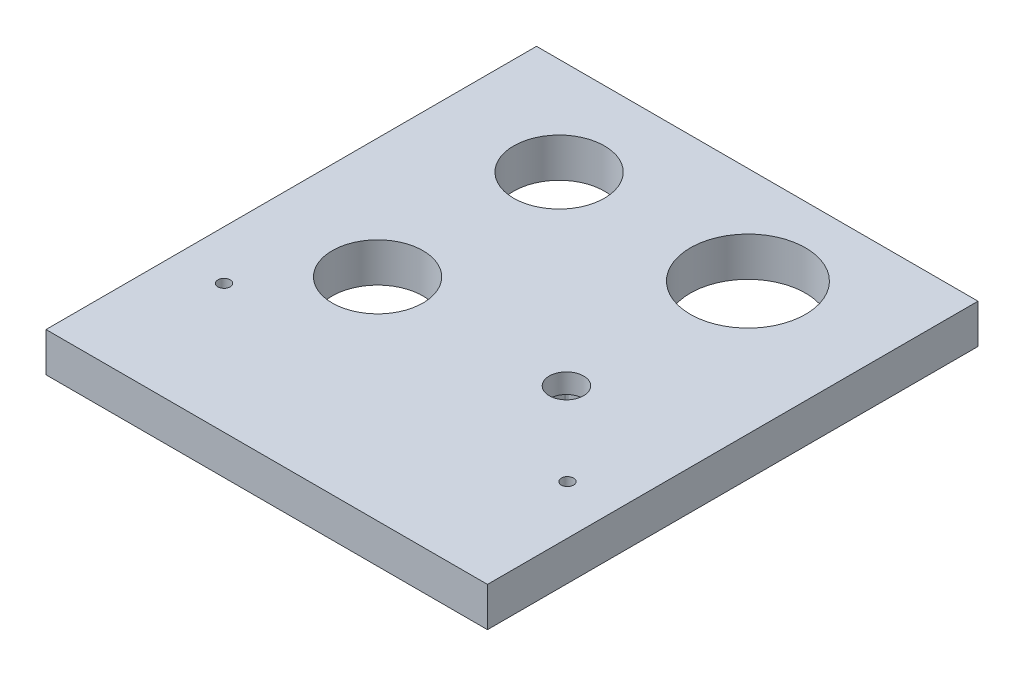
ISO-10303-21;
HEADER;
FILE_DESCRIPTION(('STEP AP214'),'2;1');
FILE_NAME('part.step','',(''),(''),'','','');
FILE_SCHEMA(('AUTOMOTIVE_DESIGN { 1 0 10303 214 1 1 1 1 }'));
ENDSEC;
DATA;
#1=APPLICATION_CONTEXT('core data for automotive mechanical design processes');
#2=APPLICATION_PROTOCOL_DEFINITION('international standard','automotive_design',2000,#1);
#3=PRODUCT_CONTEXT('',#1,'mechanical');
#4=PRODUCT('Part','Part','',(#3));
#5=PRODUCT_RELATED_PRODUCT_CATEGORY('part','',(#4));
#6=PRODUCT_DEFINITION_FORMATION('','',#4);
#7=PRODUCT_DEFINITION_CONTEXT('part definition',#1,'design');
#8=PRODUCT_DEFINITION('design','',#6,#7);
#9=PRODUCT_DEFINITION_SHAPE('','',#8);
#10=(LENGTH_UNIT() NAMED_UNIT(*) SI_UNIT(.MILLI.,.METRE.));
#11=(NAMED_UNIT(*) PLANE_ANGLE_UNIT() SI_UNIT($,.RADIAN.));
#12=(NAMED_UNIT(*) SI_UNIT($,.STERADIAN.) SOLID_ANGLE_UNIT());
#13=UNCERTAINTY_MEASURE_WITH_UNIT(LENGTH_MEASURE(1.E-05),#10,'distance_accuracy_value','');
#14=(GEOMETRIC_REPRESENTATION_CONTEXT(3) GLOBAL_UNCERTAINTY_ASSIGNED_CONTEXT((#13)) GLOBAL_UNIT_ASSIGNED_CONTEXT((#10,
#11,#12)) REPRESENTATION_CONTEXT('',''));
#15=CARTESIAN_POINT('',(0.,0.,0.));
#16=DIRECTION('',(0.,0.,1.));
#17=DIRECTION('',(1.,0.,0.));
#18=AXIS2_PLACEMENT_3D('',#15,#16,#17);
#19=CARTESIAN_POINT('',(-45.,8.,-50.));
#20=DIRECTION('',(1.,0.,0.));
#21=DIRECTION('',(0.,0.,-1.));
#22=AXIS2_PLACEMENT_3D('',#19,#20,#21);
#23=PLANE('',#22);
#24=DIRECTION('',(0.,0.,1.));
#25=VECTOR('',#24,1.);
#26=CARTESIAN_POINT('',(-45.,0.,-50.));
#27=LINE('',#26,#25);
#28=CARTESIAN_POINT('',(-45.,0.,-50.));
#29=VERTEX_POINT('',#28);
#30=CARTESIAN_POINT('',(-45.,0.,50.));
#31=VERTEX_POINT('',#30);
#32=EDGE_CURVE('E151',#29,#31,#27,.T.);
#33=ORIENTED_EDGE('',*,*,#32,.T.);
#34=DIRECTION('',(0.,-1.,0.));
#35=VECTOR('',#34,1.);
#36=CARTESIAN_POINT('',(-45.,8.,50.));
#37=LINE('',#36,#35);
#38=CARTESIAN_POINT('',(-45.,8.,50.));
#39=VERTEX_POINT('',#38);
#40=EDGE_CURVE('E132',#39,#31,#37,.T.);
#41=ORIENTED_EDGE('',*,*,#40,.F.);
#42=DIRECTION('',(0.,0.,1.));
#43=VECTOR('',#42,1.);
#44=CARTESIAN_POINT('',(-45.,8.,-50.));
#45=LINE('',#44,#43);
#46=CARTESIAN_POINT('',(-45.,8.,-50.));
#47=VERTEX_POINT('',#46);
#48=EDGE_CURVE('E139',#47,#39,#45,.T.);
#49=ORIENTED_EDGE('',*,*,#48,.F.);
#50=DIRECTION('',(0.,-1.,0.));
#51=VECTOR('',#50,1.);
#52=CARTESIAN_POINT('',(-45.,8.,-50.));
#53=LINE('',#52,#51);
#54=EDGE_CURVE('E250',#47,#29,#53,.T.);
#55=ORIENTED_EDGE('',*,*,#54,.T.);
#56=EDGE_LOOP('',(#33,#41,#49,#55));
#57=FACE_BOUND('',#56,.T.);
#58=ADVANCED_FACE('F38',(#57),#23,.F.);
#59=CARTESIAN_POINT('',(45.,8.,50.));
#60=DIRECTION('',(0.,0.,-1.));
#61=DIRECTION('',(-1.,0.,0.));
#62=AXIS2_PLACEMENT_3D('',#59,#60,#61);
#63=PLANE('',#62);
#64=DIRECTION('',(1.,0.,0.));
#65=VECTOR('',#64,1.);
#66=CARTESIAN_POINT('',(45.,0.,50.));
#67=LINE('',#66,#65);
#68=CARTESIAN_POINT('',(45.,0.,50.));
#69=VERTEX_POINT('',#68);
#70=EDGE_CURVE('E252',#31,#69,#67,.T.);
#71=ORIENTED_EDGE('',*,*,#70,.T.);
#72=DIRECTION('',(0.,-1.,0.));
#73=VECTOR('',#72,1.);
#74=CARTESIAN_POINT('',(45.,8.,50.));
#75=LINE('',#74,#73);
#76=CARTESIAN_POINT('',(45.,8.,50.));
#77=VERTEX_POINT('',#76);
#78=EDGE_CURVE('E135',#77,#69,#75,.T.);
#79=ORIENTED_EDGE('',*,*,#78,.F.);
#80=DIRECTION('',(1.,0.,0.));
#81=VECTOR('',#80,1.);
#82=CARTESIAN_POINT('',(45.,8.,50.));
#83=LINE('',#82,#81);
#84=EDGE_CURVE('E128',#39,#77,#83,.T.);
#85=ORIENTED_EDGE('',*,*,#84,.F.);
#86=ORIENTED_EDGE('',*,*,#40,.T.);
#87=EDGE_LOOP('',(#71,#79,#85,#86));
#88=FACE_BOUND('',#87,.T.);
#89=ADVANCED_FACE('F130',(#88),#63,.F.);
#90=CARTESIAN_POINT('',(45.,8.,-50.));
#91=DIRECTION('',(-1.,0.,0.));
#92=DIRECTION('',(0.,0.,1.));
#93=AXIS2_PLACEMENT_3D('',#90,#91,#92);
#94=PLANE('',#93);
#95=DIRECTION('',(0.,0.,-1.));
#96=VECTOR('',#95,1.);
#97=CARTESIAN_POINT('',(45.,0.,-50.));
#98=LINE('',#97,#96);
#99=CARTESIAN_POINT('',(45.,0.,-50.));
#100=VERTEX_POINT('',#99);
#101=EDGE_CURVE('E254',#69,#100,#98,.T.);
#102=ORIENTED_EDGE('',*,*,#101,.T.);
#103=DIRECTION('',(0.,-1.,0.));
#104=VECTOR('',#103,1.);
#105=CARTESIAN_POINT('',(45.,8.,-50.));
#106=LINE('',#105,#104);
#107=CARTESIAN_POINT('',(45.,8.,-50.));
#108=VERTEX_POINT('',#107);
#109=EDGE_CURVE('E156',#108,#100,#106,.T.);
#110=ORIENTED_EDGE('',*,*,#109,.F.);
#111=DIRECTION('',(0.,0.,-1.));
#112=VECTOR('',#111,1.);
#113=CARTESIAN_POINT('',(45.,8.,-50.));
#114=LINE('',#113,#112);
#115=EDGE_CURVE('E138',#77,#108,#114,.T.);
#116=ORIENTED_EDGE('',*,*,#115,.F.);
#117=ORIENTED_EDGE('',*,*,#78,.T.);
#118=EDGE_LOOP('',(#102,#110,#116,#117));
#119=FACE_BOUND('',#118,.T.);
#120=ADVANCED_FACE('F266',(#119),#94,.F.);
#121=CARTESIAN_POINT('',(45.,8.,-50.));
#122=DIRECTION('',(0.,0.,1.));
#123=DIRECTION('',(1.,0.,0.));
#124=AXIS2_PLACEMENT_3D('',#121,#122,#123);
#125=PLANE('',#124);
#126=DIRECTION('',(-1.,0.,0.));
#127=VECTOR('',#126,1.);
#128=CARTESIAN_POINT('',(45.,0.,-50.));
#129=LINE('',#128,#127);
#130=EDGE_CURVE('E148',#100,#29,#129,.T.);
#131=ORIENTED_EDGE('',*,*,#130,.T.);
#132=ORIENTED_EDGE('',*,*,#54,.F.);
#133=DIRECTION('',(-1.,0.,0.));
#134=VECTOR('',#133,1.);
#135=CARTESIAN_POINT('',(45.,8.,-50.));
#136=LINE('',#135,#134);
#137=EDGE_CURVE('E144',#108,#47,#136,.T.);
#138=ORIENTED_EDGE('',*,*,#137,.F.);
#139=ORIENTED_EDGE('',*,*,#109,.T.);
#140=EDGE_LOOP('',(#131,#132,#138,#139));
#141=FACE_BOUND('',#140,.T.);
#142=ADVANCED_FACE('F261',(#141),#125,.F.);
#143=CARTESIAN_POINT('',(0.,8.,0.));
#144=DIRECTION('',(0.,-1.,0.));
#145=DIRECTION('',(0.,0.,-1.));
#146=AXIS2_PLACEMENT_3D('',#143,#144,#145);
#147=PLANE('',#146);
#148=CARTESIAN_POINT('',(35.0000000000009,8.,23.7));
#149=DIRECTION('',(0.,1.,0.));
#150=DIRECTION('',(0.,0.,1.));
#151=AXIS2_PLACEMENT_3D('',#148,#149,#150);
#152=CIRCLE('',#151,1.25);
#153=CARTESIAN_POINT('',(35.0000000000009,8.,24.95));
#154=VERTEX_POINT('',#153);
#155=EDGE_CURVE('E205',#154,#154,#152,.T.);
#156=ORIENTED_EDGE('',*,*,#155,.F.);
#157=EDGE_LOOP('',(#156));
#158=FACE_BOUND('',#157,.T.);
#159=CARTESIAN_POINT('',(-34.9999999999991,8.,23.7));
#160=DIRECTION('',(0.,1.,0.));
#161=DIRECTION('',(0.,0.,1.));
#162=AXIS2_PLACEMENT_3D('',#159,#160,#161);
#163=CIRCLE('',#162,1.25);
#164=CARTESIAN_POINT('',(-34.9999999999991,8.,24.95));
#165=VERTEX_POINT('',#164);
#166=EDGE_CURVE('E195',#165,#165,#163,.T.);
#167=ORIENTED_EDGE('',*,*,#166,.F.);
#168=EDGE_LOOP('',(#167));
#169=FACE_BOUND('',#168,.T.);
#170=CARTESIAN_POINT('',(18.,8.,6.89999999999999));
#171=DIRECTION('',(0.,-1.,0.));
#172=DIRECTION('',(0.,0.,-1.));
#173=AXIS2_PLACEMENT_3D('',#170,#171,#172);
#174=CIRCLE('',#173,3.5);
#175=CARTESIAN_POINT('',(18.,8.,3.39999999999999));
#176=VERTEX_POINT('',#175);
#177=EDGE_CURVE('E189',#176,#176,#174,.T.);
#178=ORIENTED_EDGE('',*,*,#177,.T.);
#179=EDGE_LOOP('',(#178));
#180=FACE_BOUND('',#179,.T.);
#181=CARTESIAN_POINT('',(18.,8.,-30.1));
#182=DIRECTION('',(0.,1.,0.));
#183=DIRECTION('',(0.,0.,1.));
#184=AXIS2_PLACEMENT_3D('',#181,#182,#183);
#185=CIRCLE('',#184,11.75);
#186=CARTESIAN_POINT('',(18.,8.,-18.35));
#187=VERTEX_POINT('',#186);
#188=EDGE_CURVE('E230',#187,#187,#185,.T.);
#189=ORIENTED_EDGE('',*,*,#188,.F.);
#190=EDGE_LOOP('',(#189));
#191=FACE_BOUND('',#190,.T.);
#192=CARTESIAN_POINT('',(-20.5,8.,6.89999999999998));
#193=DIRECTION('',(0.,1.,0.));
#194=DIRECTION('',(0.,0.,1.));
#195=AXIS2_PLACEMENT_3D('',#192,#193,#194);
#196=CIRCLE('',#195,9.25);
#197=CARTESIAN_POINT('',(-20.5,8.,16.15));
#198=VERTEX_POINT('',#197);
#199=EDGE_CURVE('E236',#198,#198,#196,.T.);
#200=ORIENTED_EDGE('',*,*,#199,.F.);
#201=EDGE_LOOP('',(#200));
#202=FACE_BOUND('',#201,.T.);
#203=CARTESIAN_POINT('',(-20.5,8.,-30.1));
#204=DIRECTION('',(0.,1.,0.));
#205=DIRECTION('',(0.,0.,1.));
#206=AXIS2_PLACEMENT_3D('',#203,#204,#205);
#207=CIRCLE('',#206,9.25);
#208=CARTESIAN_POINT('',(-20.5,8.,-20.85));
#209=VERTEX_POINT('',#208);
#210=EDGE_CURVE('E242',#209,#209,#207,.T.);
#211=ORIENTED_EDGE('',*,*,#210,.F.);
#212=EDGE_LOOP('',(#211));
#213=FACE_BOUND('',#212,.T.);
#214=ORIENTED_EDGE('',*,*,#48,.T.);
#215=ORIENTED_EDGE('',*,*,#84,.T.);
#216=ORIENTED_EDGE('',*,*,#115,.T.);
#217=ORIENTED_EDGE('',*,*,#137,.T.);
#218=EDGE_LOOP('',(#214,#215,#216,#217));
#219=FACE_BOUND('',#218,.T.);
#220=ADVANCED_FACE('F142',(#158,#169,#180,#191,#202,#213,#219),#147,.F.);
#221=CARTESIAN_POINT('',(0.,0.,0.));
#222=DIRECTION('',(0.,-1.,0.));
#223=DIRECTION('',(0.,0.,-1.));
#224=AXIS2_PLACEMENT_3D('',#221,#222,#223);
#225=PLANE('',#224);
#226=CARTESIAN_POINT('',(35.0000000000009,0.,23.7));
#227=DIRECTION('',(0.,-1.,0.));
#228=DIRECTION('',(0.,0.,-1.));
#229=AXIS2_PLACEMENT_3D('',#226,#227,#228);
#230=CIRCLE('',#229,1.25);
#231=CARTESIAN_POINT('',(35.0000000000009,0.,22.45));
#232=VERTEX_POINT('',#231);
#233=EDGE_CURVE('E42',#232,#232,#230,.T.);
#234=ORIENTED_EDGE('',*,*,#233,.F.);
#235=EDGE_LOOP('',(#234));
#236=FACE_BOUND('',#235,.T.);
#237=CARTESIAN_POINT('',(-34.9999999999991,0.,23.7));
#238=DIRECTION('',(0.,-1.,0.));
#239=DIRECTION('',(0.,0.,-1.));
#240=AXIS2_PLACEMENT_3D('',#237,#238,#239);
#241=CIRCLE('',#240,1.25);
#242=CARTESIAN_POINT('',(-34.9999999999991,0.,22.45));
#243=VERTEX_POINT('',#242);
#244=EDGE_CURVE('E193',#243,#243,#241,.T.);
#245=ORIENTED_EDGE('',*,*,#244,.F.);
#246=EDGE_LOOP('',(#245));
#247=FACE_BOUND('',#246,.T.);
#248=DIRECTION('',(0.,0.,-1.));
#249=VECTOR('',#248,1.);
#250=CARTESIAN_POINT('',(14.,0.,10.9));
#251=LINE('',#250,#249);
#252=CARTESIAN_POINT('',(14.,0.,10.6));
#253=VERTEX_POINT('',#252);
#254=CARTESIAN_POINT('',(14.,0.,3.19999999999999));
#255=VERTEX_POINT('',#254);
#256=EDGE_CURVE('E191',#253,#255,#251,.T.);
#257=ORIENTED_EDGE('',*,*,#256,.F.);
#258=CARTESIAN_POINT('',(14.3,0.,10.6));
#259=DIRECTION('',(0.,-1.,0.));
#260=DIRECTION('',(0.,0.,-1.));
#261=AXIS2_PLACEMENT_3D('',#258,#259,#260);
#262=CIRCLE('',#261,0.3);
#263=CARTESIAN_POINT('',(14.3,0.,10.9));
#264=VERTEX_POINT('',#263);
#265=EDGE_CURVE('E184',#253,#264,#262,.F.);
#266=ORIENTED_EDGE('',*,*,#265,.T.);
#267=DIRECTION('',(-1.,0.,0.));
#268=VECTOR('',#267,1.);
#269=CARTESIAN_POINT('',(22.,0.,10.9));
#270=LINE('',#269,#268);
#271=CARTESIAN_POINT('',(21.7,0.,10.9));
#272=VERTEX_POINT('',#271);
#273=EDGE_CURVE('E212',#272,#264,#270,.T.);
#274=ORIENTED_EDGE('',*,*,#273,.F.);
#275=CARTESIAN_POINT('',(21.7,0.,10.6));
#276=DIRECTION('',(0.,-1.,0.));
#277=DIRECTION('',(0.,0.,-1.));
#278=AXIS2_PLACEMENT_3D('',#275,#276,#277);
#279=CIRCLE('',#278,0.3);
#280=CARTESIAN_POINT('',(22.,0.,10.6));
#281=VERTEX_POINT('',#280);
#282=EDGE_CURVE('E12',#272,#281,#279,.F.);
#283=ORIENTED_EDGE('',*,*,#282,.T.);
#284=DIRECTION('',(0.,0.,1.));
#285=VECTOR('',#284,1.);
#286=CARTESIAN_POINT('',(22.,0.,10.9));
#287=LINE('',#286,#285);
#288=CARTESIAN_POINT('',(22.,0.,3.19999999999999));
#289=VERTEX_POINT('',#288);
#290=EDGE_CURVE('E224',#289,#281,#287,.T.);
#291=ORIENTED_EDGE('',*,*,#290,.F.);
#292=CARTESIAN_POINT('',(21.7,0.,3.19999999999999));
#293=DIRECTION('',(0.,-1.,0.));
#294=DIRECTION('',(0.,0.,-1.));
#295=AXIS2_PLACEMENT_3D('',#292,#293,#294);
#296=CIRCLE('',#295,0.3);
#297=CARTESIAN_POINT('',(21.7,0.,2.89999999999999));
#298=VERTEX_POINT('',#297);
#299=EDGE_CURVE('E47',#289,#298,#296,.F.);
#300=ORIENTED_EDGE('',*,*,#299,.T.);
#301=DIRECTION('',(1.,0.,0.));
#302=VECTOR('',#301,1.);
#303=CARTESIAN_POINT('',(22.,0.,2.89999999999999));
#304=LINE('',#303,#302);
#305=CARTESIAN_POINT('',(14.3,0.,2.89999999999999));
#306=VERTEX_POINT('',#305);
#307=EDGE_CURVE('E221',#306,#298,#304,.T.);
#308=ORIENTED_EDGE('',*,*,#307,.F.);
#309=CARTESIAN_POINT('',(14.3,0.,3.19999999999999));
#310=DIRECTION('',(0.,-1.,0.));
#311=DIRECTION('',(0.,0.,-1.));
#312=AXIS2_PLACEMENT_3D('',#309,#310,#311);
#313=CIRCLE('',#312,0.3);
#314=EDGE_CURVE('E186',#306,#255,#313,.F.);
#315=ORIENTED_EDGE('',*,*,#314,.T.);
#316=EDGE_LOOP('',(#257,#266,#274,#283,#291,#300,#308,#315));
#317=FACE_BOUND('',#316,.T.);
#318=CARTESIAN_POINT('',(18.,0.,-30.1));
#319=DIRECTION('',(0.,1.,0.));
#320=DIRECTION('',(0.,0.,1.));
#321=AXIS2_PLACEMENT_3D('',#318,#319,#320);
#322=CIRCLE('',#321,11.75);
#323=CARTESIAN_POINT('',(18.,0.,-18.35));
#324=VERTEX_POINT('',#323);
#325=EDGE_CURVE('E233',#324,#324,#322,.T.);
#326=ORIENTED_EDGE('',*,*,#325,.T.);
#327=EDGE_LOOP('',(#326));
#328=FACE_BOUND('',#327,.T.);
#329=CARTESIAN_POINT('',(-20.5,0.,6.89999999999998));
#330=DIRECTION('',(0.,1.,0.));
#331=DIRECTION('',(0.,0.,1.));
#332=AXIS2_PLACEMENT_3D('',#329,#330,#331);
#333=CIRCLE('',#332,9.25);
#334=CARTESIAN_POINT('',(-20.5,0.,16.15));
#335=VERTEX_POINT('',#334);
#336=EDGE_CURVE('E239',#335,#335,#333,.T.);
#337=ORIENTED_EDGE('',*,*,#336,.T.);
#338=EDGE_LOOP('',(#337));
#339=FACE_BOUND('',#338,.T.);
#340=CARTESIAN_POINT('',(-20.5,0.,-30.1));
#341=DIRECTION('',(0.,1.,0.));
#342=DIRECTION('',(0.,0.,1.));
#343=AXIS2_PLACEMENT_3D('',#340,#341,#342);
#344=CIRCLE('',#343,9.25);
#345=CARTESIAN_POINT('',(-20.5,0.,-20.85));
#346=VERTEX_POINT('',#345);
#347=EDGE_CURVE('E245',#346,#346,#344,.T.);
#348=ORIENTED_EDGE('',*,*,#347,.T.);
#349=EDGE_LOOP('',(#348));
#350=FACE_BOUND('',#349,.T.);
#351=ORIENTED_EDGE('',*,*,#32,.F.);
#352=ORIENTED_EDGE('',*,*,#130,.F.);
#353=ORIENTED_EDGE('',*,*,#101,.F.);
#354=ORIENTED_EDGE('',*,*,#70,.F.);
#355=EDGE_LOOP('',(#351,#352,#353,#354));
#356=FACE_BOUND('',#355,.T.);
#357=ADVANCED_FACE('F265',(#236,#247,#317,#328,#339,#350,#356),#225,.T.);
#358=CARTESIAN_POINT('',(-20.5,8.,-30.1));
#359=DIRECTION('',(0.,1.,0.));
#360=DIRECTION('',(0.,0.,1.));
#361=AXIS2_PLACEMENT_3D('',#358,#359,#360);
#362=CYLINDRICAL_SURFACE('',#361,9.25);
#363=ORIENTED_EDGE('',*,*,#347,.F.);
#364=EDGE_LOOP('',(#363));
#365=FACE_BOUND('',#364,.T.);
#366=ORIENTED_EDGE('',*,*,#210,.T.);
#367=EDGE_LOOP('',(#366));
#368=FACE_BOUND('',#367,.T.);
#369=ADVANCED_FACE('F322',(#365,#368),#362,.F.);
#370=CARTESIAN_POINT('',(-20.5,8.,6.89999999999998));
#371=DIRECTION('',(0.,1.,0.));
#372=DIRECTION('',(0.,0.,1.));
#373=AXIS2_PLACEMENT_3D('',#370,#371,#372);
#374=CYLINDRICAL_SURFACE('',#373,9.25);
#375=ORIENTED_EDGE('',*,*,#336,.F.);
#376=EDGE_LOOP('',(#375));
#377=FACE_BOUND('',#376,.T.);
#378=ORIENTED_EDGE('',*,*,#199,.T.);
#379=EDGE_LOOP('',(#378));
#380=FACE_BOUND('',#379,.T.);
#381=ADVANCED_FACE('F333',(#377,#380),#374,.F.);
#382=CARTESIAN_POINT('',(18.,8.,-30.1));
#383=DIRECTION('',(0.,1.,0.));
#384=DIRECTION('',(0.,0.,1.));
#385=AXIS2_PLACEMENT_3D('',#382,#383,#384);
#386=CYLINDRICAL_SURFACE('',#385,11.75);
#387=ORIENTED_EDGE('',*,*,#325,.F.);
#388=EDGE_LOOP('',(#387));
#389=FACE_BOUND('',#388,.T.);
#390=ORIENTED_EDGE('',*,*,#188,.T.);
#391=EDGE_LOOP('',(#390));
#392=FACE_BOUND('',#391,.T.);
#393=ADVANCED_FACE('F347',(#389,#392),#386,.F.);
#394=CARTESIAN_POINT('',(14.,19.3137084989848,10.9));
#395=DIRECTION('',(-1.,0.,0.));
#396=DIRECTION('',(0.,0.,1.));
#397=AXIS2_PLACEMENT_3D('',#394,#395,#396);
#398=PLANE('',#397);
#399=DIRECTION('',(0.,0.,1.));
#400=VECTOR('',#399,1.);
#401=CARTESIAN_POINT('',(14.,4.,10.9));
#402=LINE('',#401,#400);
#403=CARTESIAN_POINT('',(14.,4.,3.19999999999999));
#404=VERTEX_POINT('',#403);
#405=CARTESIAN_POINT('',(14.,4.,10.6));
#406=VERTEX_POINT('',#405);
#407=EDGE_CURVE('E215',#404,#406,#402,.T.);
#408=ORIENTED_EDGE('',*,*,#407,.T.);
#409=DIRECTION('',(0.,-1.,0.));
#410=VECTOR('',#409,1.);
#411=CARTESIAN_POINT('',(14.,0.,10.6));
#412=LINE('',#411,#410);
#413=EDGE_CURVE('E154',#406,#253,#412,.T.);
#414=ORIENTED_EDGE('',*,*,#413,.T.);
#415=ORIENTED_EDGE('',*,*,#256,.T.);
#416=DIRECTION('',(0.,-1.,0.));
#417=VECTOR('',#416,1.);
#418=CARTESIAN_POINT('',(14.,4.,3.19999999999999));
#419=LINE('',#418,#417);
#420=EDGE_CURVE('E152',#255,#404,#419,.F.);
#421=ORIENTED_EDGE('',*,*,#420,.T.);
#422=EDGE_LOOP('',(#408,#414,#415,#421));
#423=FACE_BOUND('',#422,.T.);
#424=ADVANCED_FACE('F313',(#423),#398,.F.);
#425=CARTESIAN_POINT('',(22.,19.3137084989848,10.9));
#426=DIRECTION('',(0.,0.,1.));
#427=DIRECTION('',(1.,0.,0.));
#428=AXIS2_PLACEMENT_3D('',#425,#426,#427);
#429=PLANE('',#428);
#430=ORIENTED_EDGE('',*,*,#273,.T.);
#431=DIRECTION('',(0.,-1.,0.));
#432=VECTOR('',#431,1.);
#433=CARTESIAN_POINT('',(14.3,4.,10.9));
#434=LINE('',#433,#432);
#435=CARTESIAN_POINT('',(14.3,4.,10.9));
#436=VERTEX_POINT('',#435);
#437=EDGE_CURVE('E165',#264,#436,#434,.F.);
#438=ORIENTED_EDGE('',*,*,#437,.T.);
#439=DIRECTION('',(1.,0.,0.));
#440=VECTOR('',#439,1.);
#441=CARTESIAN_POINT('',(22.,4.,10.9));
#442=LINE('',#441,#440);
#443=CARTESIAN_POINT('',(21.7,4.,10.9));
#444=VERTEX_POINT('',#443);
#445=EDGE_CURVE('E211',#436,#444,#442,.T.);
#446=ORIENTED_EDGE('',*,*,#445,.T.);
#447=DIRECTION('',(0.,-1.,0.));
#448=VECTOR('',#447,1.);
#449=CARTESIAN_POINT('',(21.7,0.,10.9));
#450=LINE('',#449,#448);
#451=EDGE_CURVE('E162',#444,#272,#450,.T.);
#452=ORIENTED_EDGE('',*,*,#451,.T.);
#453=EDGE_LOOP('',(#430,#438,#446,#452));
#454=FACE_BOUND('',#453,.T.);
#455=ADVANCED_FACE('F307',(#454),#429,.F.);
#456=CARTESIAN_POINT('',(22.,19.3137084989848,10.9));
#457=DIRECTION('',(1.,0.,0.));
#458=DIRECTION('',(0.,0.,-1.));
#459=AXIS2_PLACEMENT_3D('',#456,#457,#458);
#460=PLANE('',#459);
#461=DIRECTION('',(0.,0.,-1.));
#462=VECTOR('',#461,1.);
#463=CARTESIAN_POINT('',(22.,4.,10.9));
#464=LINE('',#463,#462);
#465=CARTESIAN_POINT('',(22.,4.,10.6));
#466=VERTEX_POINT('',#465);
#467=CARTESIAN_POINT('',(22.,4.,3.19999999999999));
#468=VERTEX_POINT('',#467);
#469=EDGE_CURVE('E208',#466,#468,#464,.T.);
#470=ORIENTED_EDGE('',*,*,#469,.T.);
#471=DIRECTION('',(0.,-1.,0.));
#472=VECTOR('',#471,1.);
#473=CARTESIAN_POINT('',(22.,0.,3.19999999999999));
#474=LINE('',#473,#472);
#475=EDGE_CURVE('E182',#468,#289,#474,.T.);
#476=ORIENTED_EDGE('',*,*,#475,.T.);
#477=ORIENTED_EDGE('',*,*,#290,.T.);
#478=DIRECTION('',(0.,-1.,0.));
#479=VECTOR('',#478,1.);
#480=CARTESIAN_POINT('',(22.,4.,10.6));
#481=LINE('',#480,#479);
#482=EDGE_CURVE('E180',#281,#466,#481,.F.);
#483=ORIENTED_EDGE('',*,*,#482,.T.);
#484=EDGE_LOOP('',(#470,#476,#477,#483));
#485=FACE_BOUND('',#484,.T.);
#486=ADVANCED_FACE('F302',(#485),#460,.F.);
#487=CARTESIAN_POINT('',(22.,19.3137084989848,2.89999999999999));
#488=DIRECTION('',(0.,0.,-1.));
#489=DIRECTION('',(-1.,0.,0.));
#490=AXIS2_PLACEMENT_3D('',#487,#488,#489);
#491=PLANE('',#490);
#492=DIRECTION('',(-1.,0.,0.));
#493=VECTOR('',#492,1.);
#494=CARTESIAN_POINT('',(22.,4.,2.89999999999999));
#495=LINE('',#494,#493);
#496=CARTESIAN_POINT('',(21.7,4.,2.89999999999999));
#497=VERTEX_POINT('',#496);
#498=CARTESIAN_POINT('',(14.3,4.,2.89999999999999));
#499=VERTEX_POINT('',#498);
#500=EDGE_CURVE('E218',#497,#499,#495,.T.);
#501=ORIENTED_EDGE('',*,*,#500,.T.);
#502=DIRECTION('',(0.,-1.,0.));
#503=VECTOR('',#502,1.);
#504=CARTESIAN_POINT('',(14.3,0.,2.89999999999999));
#505=LINE('',#504,#503);
#506=EDGE_CURVE('E177',#499,#306,#505,.T.);
#507=ORIENTED_EDGE('',*,*,#506,.T.);
#508=ORIENTED_EDGE('',*,*,#307,.T.);
#509=DIRECTION('',(0.,-1.,0.));
#510=VECTOR('',#509,1.);
#511=CARTESIAN_POINT('',(21.7,4.,2.89999999999999));
#512=LINE('',#511,#510);
#513=EDGE_CURVE('E175',#298,#497,#512,.F.);
#514=ORIENTED_EDGE('',*,*,#513,.T.);
#515=EDGE_LOOP('',(#501,#507,#508,#514));
#516=FACE_BOUND('',#515,.T.);
#517=ADVANCED_FACE('F318',(#516),#491,.F.);
#518=CARTESIAN_POINT('',(0.,4.,0.));
#519=DIRECTION('',(0.,-1.,0.));
#520=DIRECTION('',(0.,0.,-1.));
#521=AXIS2_PLACEMENT_3D('',#518,#519,#520);
#522=PLANE('',#521);
#523=CARTESIAN_POINT('',(18.,4.,6.89999999999999));
#524=DIRECTION('',(0.,-1.,0.));
#525=DIRECTION('',(0.,0.,-1.));
#526=AXIS2_PLACEMENT_3D('',#523,#524,#525);
#527=CIRCLE('',#526,3.5);
#528=CARTESIAN_POINT('',(18.,4.,3.39999999999999));
#529=VERTEX_POINT('',#528);
#530=EDGE_CURVE('E192',#529,#529,#527,.T.);
#531=ORIENTED_EDGE('',*,*,#530,.F.);
#532=EDGE_LOOP('',(#531));
#533=FACE_BOUND('',#532,.T.);
#534=ORIENTED_EDGE('',*,*,#445,.F.);
#535=CARTESIAN_POINT('',(14.3,4.,10.6));
#536=DIRECTION('',(0.,-1.,0.));
#537=DIRECTION('',(0.,0.,-1.));
#538=AXIS2_PLACEMENT_3D('',#535,#536,#537);
#539=CIRCLE('',#538,0.3);
#540=EDGE_CURVE('E173',#436,#406,#539,.T.);
#541=ORIENTED_EDGE('',*,*,#540,.T.);
#542=ORIENTED_EDGE('',*,*,#407,.F.);
#543=CARTESIAN_POINT('',(14.3,4.,3.19999999999999));
#544=DIRECTION('',(0.,-1.,0.));
#545=DIRECTION('',(0.,0.,-1.));
#546=AXIS2_PLACEMENT_3D('',#543,#544,#545);
#547=CIRCLE('',#546,0.3);
#548=EDGE_CURVE('E171',#404,#499,#547,.T.);
#549=ORIENTED_EDGE('',*,*,#548,.T.);
#550=ORIENTED_EDGE('',*,*,#500,.F.);
#551=CARTESIAN_POINT('',(21.7,4.,3.19999999999999));
#552=DIRECTION('',(0.,-1.,0.));
#553=DIRECTION('',(0.,0.,-1.));
#554=AXIS2_PLACEMENT_3D('',#551,#552,#553);
#555=CIRCLE('',#554,0.3);
#556=EDGE_CURVE('E169',#497,#468,#555,.T.);
#557=ORIENTED_EDGE('',*,*,#556,.T.);
#558=ORIENTED_EDGE('',*,*,#469,.F.);
#559=CARTESIAN_POINT('',(21.7,4.,10.6));
#560=DIRECTION('',(0.,-1.,0.));
#561=DIRECTION('',(0.,0.,-1.));
#562=AXIS2_PLACEMENT_3D('',#559,#560,#561);
#563=CIRCLE('',#562,0.3);
#564=EDGE_CURVE('E167',#466,#444,#563,.T.);
#565=ORIENTED_EDGE('',*,*,#564,.T.);
#566=EDGE_LOOP('',(#534,#541,#542,#549,#550,#557,#558,#565));
#567=FACE_BOUND('',#566,.T.);
#568=ADVANCED_FACE('F284',(#533,#567),#522,.T.);
#569=CARTESIAN_POINT('',(14.3,19.3137084989848,10.6));
#570=DIRECTION('',(0.,1.,0.));
#571=DIRECTION('',(0.,0.,1.));
#572=AXIS2_PLACEMENT_3D('',#569,#570,#571);
#573=CYLINDRICAL_SURFACE('',#572,0.3);
#574=ORIENTED_EDGE('',*,*,#540,.F.);
#575=ORIENTED_EDGE('',*,*,#437,.F.);
#576=ORIENTED_EDGE('',*,*,#265,.F.);
#577=ORIENTED_EDGE('',*,*,#413,.F.);
#578=EDGE_LOOP('',(#574,#575,#576,#577));
#579=FACE_BOUND('',#578,.T.);
#580=ADVANCED_FACE('F280',(#579),#573,.F.);
#581=CARTESIAN_POINT('',(14.3,19.3137084989848,3.19999999999999));
#582=DIRECTION('',(0.,1.,0.));
#583=DIRECTION('',(0.,0.,1.));
#584=AXIS2_PLACEMENT_3D('',#581,#582,#583);
#585=CYLINDRICAL_SURFACE('',#584,0.3);
#586=ORIENTED_EDGE('',*,*,#548,.F.);
#587=ORIENTED_EDGE('',*,*,#420,.F.);
#588=ORIENTED_EDGE('',*,*,#314,.F.);
#589=ORIENTED_EDGE('',*,*,#506,.F.);
#590=EDGE_LOOP('',(#586,#587,#588,#589));
#591=FACE_BOUND('',#590,.T.);
#592=ADVANCED_FACE('F283',(#591),#585,.F.);
#593=CARTESIAN_POINT('',(21.7,19.3137084989848,3.19999999999999));
#594=DIRECTION('',(0.,1.,0.));
#595=DIRECTION('',(0.,0.,1.));
#596=AXIS2_PLACEMENT_3D('',#593,#594,#595);
#597=CYLINDRICAL_SURFACE('',#596,0.3);
#598=ORIENTED_EDGE('',*,*,#556,.F.);
#599=ORIENTED_EDGE('',*,*,#513,.F.);
#600=ORIENTED_EDGE('',*,*,#299,.F.);
#601=ORIENTED_EDGE('',*,*,#475,.F.);
#602=EDGE_LOOP('',(#598,#599,#600,#601));
#603=FACE_BOUND('',#602,.T.);
#604=ADVANCED_FACE('F287',(#603),#597,.F.);
#605=CARTESIAN_POINT('',(21.7,19.3137084989848,10.6));
#606=DIRECTION('',(0.,1.,0.));
#607=DIRECTION('',(0.,0.,1.));
#608=AXIS2_PLACEMENT_3D('',#605,#606,#607);
#609=CYLINDRICAL_SURFACE('',#608,0.3);
#610=ORIENTED_EDGE('',*,*,#564,.F.);
#611=ORIENTED_EDGE('',*,*,#482,.F.);
#612=ORIENTED_EDGE('',*,*,#282,.F.);
#613=ORIENTED_EDGE('',*,*,#451,.F.);
#614=EDGE_LOOP('',(#610,#611,#612,#613));
#615=FACE_BOUND('',#614,.T.);
#616=ADVANCED_FACE('F40',(#615),#609,.F.);
#617=CARTESIAN_POINT('',(18.,13.,6.89999999999999));
#618=DIRECTION('',(0.,-1.,0.));
#619=DIRECTION('',(0.,0.,-1.));
#620=AXIS2_PLACEMENT_3D('',#617,#618,#619);
#621=CYLINDRICAL_SURFACE('',#620,3.5);
#622=ORIENTED_EDGE('',*,*,#530,.T.);
#623=EDGE_LOOP('',(#622));
#624=FACE_BOUND('',#623,.T.);
#625=ORIENTED_EDGE('',*,*,#177,.F.);
#626=EDGE_LOOP('',(#625));
#627=FACE_BOUND('',#626,.T.);
#628=ADVANCED_FACE('F293',(#624,#627),#621,.F.);
#629=CARTESIAN_POINT('',(-34.9999999999991,8.,23.7));
#630=DIRECTION('',(0.,1.,0.));
#631=DIRECTION('',(0.,0.,1.));
#632=AXIS2_PLACEMENT_3D('',#629,#630,#631);
#633=CYLINDRICAL_SURFACE('',#632,1.25);
#634=ORIENTED_EDGE('',*,*,#244,.T.);
#635=EDGE_LOOP('',(#634));
#636=FACE_BOUND('',#635,.T.);
#637=ORIENTED_EDGE('',*,*,#166,.T.);
#638=EDGE_LOOP('',(#637));
#639=FACE_BOUND('',#638,.T.);
#640=ADVANCED_FACE('F365',(#636,#639),#633,.F.);
#641=CARTESIAN_POINT('',(35.0000000000009,8.,23.7));
#642=DIRECTION('',(0.,1.,0.));
#643=DIRECTION('',(0.,0.,1.));
#644=AXIS2_PLACEMENT_3D('',#641,#642,#643);
#645=CYLINDRICAL_SURFACE('',#644,1.25);
#646=ORIENTED_EDGE('',*,*,#233,.T.);
#647=EDGE_LOOP('',(#646));
#648=FACE_BOUND('',#647,.T.);
#649=ORIENTED_EDGE('',*,*,#155,.T.);
#650=EDGE_LOOP('',(#649));
#651=FACE_BOUND('',#650,.T.);
#652=ADVANCED_FACE('F369',(#648,#651),#645,.F.);
#653=CLOSED_SHELL('',(#58,#89,#120,#142,#220,#357,#369,#381,#393,#424,#455,#486,#517,#568,#580,
#592,#604,#616,#628,#640,#652));
#654=MANIFOLD_SOLID_BREP('B2',#653);
#655=ADVANCED_BREP_SHAPE_REPRESENTATION('',(#18,#654),#14);
#656=SHAPE_DEFINITION_REPRESENTATION(#9,#655);
ENDSEC;
END-ISO-10303-21;
